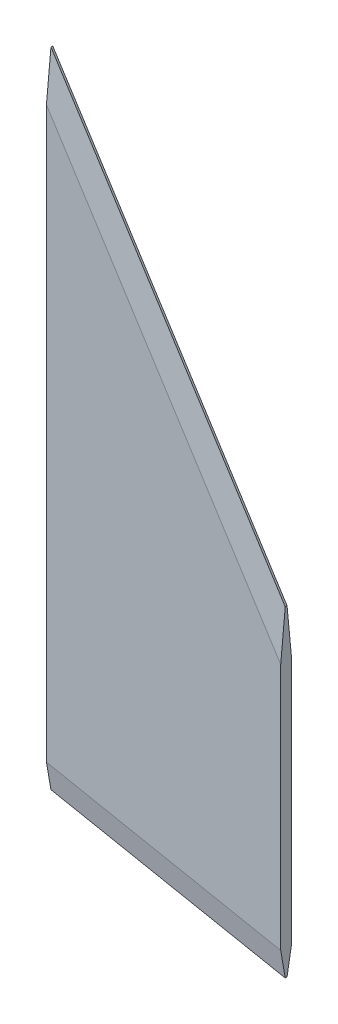
ISO-10303-21;
HEADER;
FILE_DESCRIPTION(('STEP AP214'),'2;1');
FILE_NAME('part.step','',(''),(''),'','','');
FILE_SCHEMA(('AUTOMOTIVE_DESIGN { 1 0 10303 214 1 1 1 1 }'));
ENDSEC;
DATA;
#1=APPLICATION_CONTEXT('core data for automotive mechanical design processes');
#2=APPLICATION_PROTOCOL_DEFINITION('international standard','automotive_design',2000,#1);
#3=PRODUCT_CONTEXT('',#1,'mechanical');
#4=PRODUCT('Part','Part','',(#3));
#5=PRODUCT_RELATED_PRODUCT_CATEGORY('part','',(#4));
#6=PRODUCT_DEFINITION_FORMATION('','',#4);
#7=PRODUCT_DEFINITION_CONTEXT('part definition',#1,'design');
#8=PRODUCT_DEFINITION('design','',#6,#7);
#9=PRODUCT_DEFINITION_SHAPE('','',#8);
#10=(LENGTH_UNIT() NAMED_UNIT(*) SI_UNIT(.MILLI.,.METRE.));
#11=(NAMED_UNIT(*) PLANE_ANGLE_UNIT() SI_UNIT($,.RADIAN.));
#12=(NAMED_UNIT(*) SI_UNIT($,.STERADIAN.) SOLID_ANGLE_UNIT());
#13=UNCERTAINTY_MEASURE_WITH_UNIT(LENGTH_MEASURE(1.E-05),#10,'distance_accuracy_value','');
#14=(GEOMETRIC_REPRESENTATION_CONTEXT(3) GLOBAL_UNCERTAINTY_ASSIGNED_CONTEXT((#13)) GLOBAL_UNIT_ASSIGNED_CONTEXT((#10,
#11,#12)) REPRESENTATION_CONTEXT('',''));
#15=CARTESIAN_POINT('',(0.,0.,0.));
#16=DIRECTION('',(0.,0.,1.));
#17=DIRECTION('',(1.,0.,0.));
#18=AXIS2_PLACEMENT_3D('',#15,#16,#17);
#19=CARTESIAN_POINT('',(3.78840025033068,-2.26848731655438,1.5));
#20=DIRECTION('',(-0.843227198057324,-0.537557338761545,0.));
#21=DIRECTION('',(0.537557338761545,-0.843227198057324,0.));
#22=AXIS2_PLACEMENT_3D('',#19,#20,#21);
#23=PLANE('',#22);
#24=DIRECTION('',(0.,0.,-1.));
#25=VECTOR('',#24,1.);
#26=CARTESIAN_POINT('',(3.78840025033068,-2.26848731655438,1.5));
#27=LINE('',#26,#25);
#28=CARTESIAN_POINT('',(3.78840025033068,-2.26848731655438,0.249999999999992));
#29=VERTEX_POINT('',#28);
#30=CARTESIAN_POINT('',(3.78840025033068,-2.26848731655438,-0.249999999999992));
#31=VERTEX_POINT('',#30);
#32=EDGE_CURVE('E138',#29,#31,#27,.T.);
#33=ORIENTED_EDGE('',*,*,#32,.T.);
#34=DIRECTION('',(-0.537557338761545,0.843227198057324,0.));
#35=VECTOR('',#34,1.);
#36=CARTESIAN_POINT('',(-60.9815997496693,99.3315126834455,-0.249999999999992));
#37=LINE('',#36,#35);
#38=CARTESIAN_POINT('',(-60.9815997496693,99.3315126834455,-0.249999999999992));
#39=VERTEX_POINT('',#38);
#40=EDGE_CURVE('E11',#31,#39,#37,.T.);
#41=ORIENTED_EDGE('',*,*,#40,.T.);
#42=DIRECTION('',(0.,0.,-1.));
#43=VECTOR('',#42,1.);
#44=CARTESIAN_POINT('',(-60.9815997496693,99.3315126834455,1.5));
#45=LINE('',#44,#43);
#46=CARTESIAN_POINT('',(-60.9815997496693,99.3315126834455,0.249999999999992));
#47=VERTEX_POINT('',#46);
#48=EDGE_CURVE('E143',#47,#39,#45,.T.);
#49=ORIENTED_EDGE('',*,*,#48,.F.);
#50=DIRECTION('',(0.537557338761545,-0.843227198057324,0.));
#51=VECTOR('',#50,1.);
#52=CARTESIAN_POINT('',(3.78840025033068,-2.26848731655438,0.249999999999992));
#53=LINE('',#52,#51);
#54=EDGE_CURVE('E58',#47,#29,#53,.T.);
#55=ORIENTED_EDGE('',*,*,#54,.T.);
#56=EDGE_LOOP('',(#33,#41,#49,#55));
#57=FACE_BOUND('',#56,.T.);
#58=ADVANCED_FACE('F49',(#57),#23,.F.);
#59=CARTESIAN_POINT('',(-60.9815997496693,99.3315126834455,1.5));
#60=DIRECTION('',(1.,0.,0.));
#61=DIRECTION('',(0.,1.,0.));
#62=AXIS2_PLACEMENT_3D('',#59,#60,#61);
#63=PLANE('',#62);
#64=DIRECTION('',(0.,-1.,0.));
#65=VECTOR('',#64,1.);
#66=CARTESIAN_POINT('',(-60.9815997496693,99.3315126834455,-1.5));
#67=LINE('',#66,#65);
#68=CARTESIAN_POINT('',(-60.9815997496693,86.1438920086827,-1.5));
#69=VERTEX_POINT('',#68);
#70=CARTESIAN_POINT('',(-60.9815997496693,-71.2443938226494,-1.5));
#71=VERTEX_POINT('',#70);
#72=EDGE_CURVE('E185',#69,#71,#67,.T.);
#73=ORIENTED_EDGE('',*,*,#72,.T.);
#74=DIRECTION('',(0.,-0.985357928398178,0.170498542348173));
#75=VECTOR('',#74,1.);
#76=CARTESIAN_POINT('',(-60.9815997496693,-78.4684873165544,-0.249999999999992));
#77=LINE('',#76,#75);
#78=CARTESIAN_POINT('',(-60.9815997496693,-78.4684873165544,-0.249999999999992));
#79=VERTEX_POINT('',#78);
#80=EDGE_CURVE('E160',#71,#79,#77,.T.);
#81=ORIENTED_EDGE('',*,*,#80,.T.);
#82=DIRECTION('',(0.,0.,-1.));
#83=VECTOR('',#82,1.);
#84=CARTESIAN_POINT('',(-60.9815997496693,-78.4684873165544,1.5));
#85=LINE('',#84,#83);
#86=CARTESIAN_POINT('',(-60.9815997496693,-78.4684873165544,0.249999999999992));
#87=VERTEX_POINT('',#86);
#88=EDGE_CURVE('E137',#87,#79,#85,.T.);
#89=ORIENTED_EDGE('',*,*,#88,.F.);
#90=DIRECTION('',(0.,-0.985357928398178,-0.170498542348173));
#91=VECTOR('',#90,1.);
#92=CARTESIAN_POINT('',(-60.9815997496693,-79.8631257600748,0.00868279447500541));
#93=LINE('',#92,#91);
#94=CARTESIAN_POINT('',(-60.9815997496693,-71.2443938226494,1.5));
#95=VERTEX_POINT('',#94);
#96=EDGE_CURVE('E142',#87,#95,#93,.F.);
#97=ORIENTED_EDGE('',*,*,#96,.T.);
#98=DIRECTION('',(0.,-1.,0.));
#99=VECTOR('',#98,1.);
#100=CARTESIAN_POINT('',(-60.9815997496693,99.3315126834455,1.5));
#101=LINE('',#100,#99);
#102=CARTESIAN_POINT('',(-60.9815997496693,86.1438920086828,1.5));
#103=VERTEX_POINT('',#102);
#104=EDGE_CURVE('E179',#103,#95,#101,.T.);
#105=ORIENTED_EDGE('',*,*,#104,.F.);
#106=DIRECTION('',(0.,-0.995537864795251,0.0943629151675199));
#107=VECTOR('',#106,1.);
#108=CARTESIAN_POINT('',(-60.9815997496693,-1.95756644477262,9.85077272715086));
#109=LINE('',#108,#107);
#110=EDGE_CURVE('E72',#103,#47,#109,.F.);
#111=ORIENTED_EDGE('',*,*,#110,.T.);
#112=ORIENTED_EDGE('',*,*,#48,.T.);
#113=DIRECTION('',(0.,-0.995537864795251,-0.0943629151675195));
#114=VECTOR('',#113,1.);
#115=CARTESIAN_POINT('',(-60.9815997496693,-1.36380436504888,-9.79449247630353));
#116=LINE('',#115,#114);
#117=EDGE_CURVE('E65',#39,#69,#116,.T.);
#118=ORIENTED_EDGE('',*,*,#117,.T.);
#119=EDGE_LOOP('',(#73,#81,#89,#97,#105,#111,#112,#118));
#120=FACE_BOUND('',#119,.T.);
#121=ADVANCED_FACE('F181',(#120),#63,.F.);
#122=CARTESIAN_POINT('',(-60.9815997496693,-78.4684873165544,1.5));
#123=DIRECTION('',(0.19241446072101,0.981313749677157,0.));
#124=DIRECTION('',(-0.981313749677158,0.19241446072101,0.));
#125=AXIS2_PLACEMENT_3D('',#122,#123,#124);
#126=PLANE('',#125);
#127=ORIENTED_EDGE('',*,*,#88,.T.);
#128=DIRECTION('',(0.981313749677158,-0.19241446072101,0.));
#129=VECTOR('',#128,1.);
#130=CARTESIAN_POINT('',(3.7884002503307,-91.1684873165544,-0.249999999999992));
#131=LINE('',#130,#129);
#132=CARTESIAN_POINT('',(3.7884002503307,-91.1684873165544,-0.249999999999992));
#133=VERTEX_POINT('',#132);
#134=EDGE_CURVE('E136',#79,#133,#131,.T.);
#135=ORIENTED_EDGE('',*,*,#134,.T.);
#136=DIRECTION('',(0.,0.,-1.));
#137=VECTOR('',#136,1.);
#138=CARTESIAN_POINT('',(3.7884002503307,-91.1684873165544,1.5));
#139=LINE('',#138,#137);
#140=CARTESIAN_POINT('',(3.7884002503307,-91.1684873165544,0.249999999999992));
#141=VERTEX_POINT('',#140);
#142=EDGE_CURVE('E119',#141,#133,#139,.T.);
#143=ORIENTED_EDGE('',*,*,#142,.F.);
#144=DIRECTION('',(-0.981313749677158,0.19241446072101,0.));
#145=VECTOR('',#144,1.);
#146=CARTESIAN_POINT('',(-60.9815997496693,-78.4684873165544,0.249999999999992));
#147=LINE('',#146,#145);
#148=EDGE_CURVE('E133',#141,#87,#147,.T.);
#149=ORIENTED_EDGE('',*,*,#148,.T.);
#150=EDGE_LOOP('',(#127,#135,#143,#149));
#151=FACE_BOUND('',#150,.T.);
#152=ADVANCED_FACE('F132',(#151),#126,.F.);
#153=CARTESIAN_POINT('',(3.7884002503307,-91.1684873165544,1.5));
#154=DIRECTION('',(-1.,0.,0.));
#155=DIRECTION('',(0.,-1.,0.));
#156=AXIS2_PLACEMENT_3D('',#153,#154,#155);
#157=PLANE('',#156);
#158=ORIENTED_EDGE('',*,*,#142,.T.);
#159=DIRECTION('',(0.,0.985357928398178,-0.170498542348173));
#160=VECTOR('',#159,1.);
#161=CARTESIAN_POINT('',(3.7884002503307,-78.8376731789286,-2.38362654913541));
#162=LINE('',#161,#160);
#163=CARTESIAN_POINT('',(3.7884002503307,-83.9443938226493,-1.5));
#164=VERTEX_POINT('',#163);
#165=EDGE_CURVE('E126',#133,#164,#162,.T.);
#166=ORIENTED_EDGE('',*,*,#165,.T.);
#167=DIRECTION('',(0.,1.,0.));
#168=VECTOR('',#167,1.);
#169=CARTESIAN_POINT('',(3.7884002503307,-91.1684873165544,-1.5));
#170=LINE('',#169,#168);
#171=CARTESIAN_POINT('',(3.78840025033069,-15.4561079913172,-1.5));
#172=VERTEX_POINT('',#171);
#173=EDGE_CURVE('E182',#164,#172,#170,.T.);
#174=ORIENTED_EDGE('',*,*,#173,.T.);
#175=DIRECTION('',(0.,0.995537864795251,0.0943629151675195));
#176=VECTOR('',#175,1.);
#177=CARTESIAN_POINT('',(3.78840025033068,-2.26848731655438,-0.249999999999992));
#178=LINE('',#177,#176);
#179=EDGE_CURVE('E127',#172,#31,#178,.T.);
#180=ORIENTED_EDGE('',*,*,#179,.T.);
#181=ORIENTED_EDGE('',*,*,#32,.F.);
#182=DIRECTION('',(0.,0.995537864795251,-0.0943629151675199));
#183=VECTOR('',#182,1.);
#184=CARTESIAN_POINT('',(3.78840025033068,-2.86224939627813,0.306280250847292));
#185=LINE('',#184,#183);
#186=CARTESIAN_POINT('',(3.78840025033069,-15.4561079913172,1.5));
#187=VERTEX_POINT('',#186);
#188=EDGE_CURVE('E145',#29,#187,#185,.F.);
#189=ORIENTED_EDGE('',*,*,#188,.T.);
#190=DIRECTION('',(0.,1.,0.));
#191=VECTOR('',#190,1.);
#192=CARTESIAN_POINT('',(3.7884002503307,-91.1684873165544,1.5));
#193=LINE('',#192,#191);
#194=CARTESIAN_POINT('',(3.7884002503307,-83.9443938226493,1.5));
#195=VERTEX_POINT('',#194);
#196=EDGE_CURVE('E121',#195,#187,#193,.T.);
#197=ORIENTED_EDGE('',*,*,#196,.F.);
#198=DIRECTION('',(0.,0.985357928398178,0.170498542348173));
#199=VECTOR('',#198,1.);
#200=CARTESIAN_POINT('',(3.7884002503307,-80.2323116224489,2.14230934361042));
#201=LINE('',#200,#199);
#202=EDGE_CURVE('E116',#195,#141,#201,.F.);
#203=ORIENTED_EDGE('',*,*,#202,.T.);
#204=EDGE_LOOP('',(#158,#166,#174,#180,#181,#189,#197,#203));
#205=FACE_BOUND('',#204,.T.);
#206=ADVANCED_FACE('F118',(#205),#157,.F.);
#207=CARTESIAN_POINT('',(0.,0.,1.5));
#208=DIRECTION('',(0.,0.,-1.));
#209=DIRECTION('',(-1.,0.,0.));
#210=AXIS2_PLACEMENT_3D('',#207,#208,#209);
#211=PLANE('',#210);
#212=ORIENTED_EDGE('',*,*,#104,.T.);
#213=DIRECTION('',(0.981313749677158,-0.19241446072101,0.));
#214=VECTOR('',#213,1.);
#215=CARTESIAN_POINT('',(-15.7100336262562,-80.1211714939068,1.5));
#216=LINE('',#215,#214);
#217=EDGE_CURVE('E165',#95,#195,#216,.T.);
#218=ORIENTED_EDGE('',*,*,#217,.T.);
#219=ORIENTED_EDGE('',*,*,#196,.T.);
#220=DIRECTION('',(-0.537557338761545,0.843227198057324,0.));
#221=VECTOR('',#220,1.);
#222=CARTESIAN_POINT('',(-4.31231629846213,-2.74910164026961,1.5));
#223=LINE('',#222,#221);
#224=EDGE_CURVE('E162',#187,#103,#223,.T.);
#225=ORIENTED_EDGE('',*,*,#224,.T.);
#226=EDGE_LOOP('',(#212,#218,#219,#225));
#227=FACE_BOUND('',#226,.T.);
#228=ADVANCED_FACE('F178',(#227),#211,.F.);
#229=CARTESIAN_POINT('',(0.,0.,-1.5));
#230=DIRECTION('',(0.,0.,-1.));
#231=DIRECTION('',(-1.,0.,0.));
#232=AXIS2_PLACEMENT_3D('',#229,#230,#231);
#233=PLANE('',#232);
#234=ORIENTED_EDGE('',*,*,#173,.F.);
#235=DIRECTION('',(-0.981313749677158,0.19241446072101,0.));
#236=VECTOR('',#235,1.);
#237=CARTESIAN_POINT('',(-59.617553958521,-71.5118537816981,-1.5));
#238=LINE('',#237,#236);
#239=EDGE_CURVE('E155',#164,#71,#238,.T.);
#240=ORIENTED_EDGE('',*,*,#239,.T.);
#241=ORIENTED_EDGE('',*,*,#72,.F.);
#242=DIRECTION('',(0.537557338761545,-0.843227198057324,0.));
#243=VECTOR('',#242,1.);
#244=CARTESIAN_POINT('',(-2.1893235973565,-6.07928626945496,-1.5));
#245=LINE('',#244,#243);
#246=EDGE_CURVE('E153',#69,#172,#245,.T.);
#247=ORIENTED_EDGE('',*,*,#246,.T.);
#248=EDGE_LOOP('',(#234,#240,#241,#247));
#249=FACE_BOUND('',#248,.T.);
#250=ADVANCED_FACE('F194',(#249),#233,.T.);
#251=CARTESIAN_POINT('',(-60.9815997496693,-78.4684873165544,-0.249999999999992));
#252=DIRECTION('',(-0.0334124204609679,-0.170403344350937,-0.984807753012209));
#253=DIRECTION('',(-0.981313749677158,0.19241446072101,0.));
#254=AXIS2_PLACEMENT_3D('',#251,#252,#253);
#255=PLANE('',#254);
#256=ORIENTED_EDGE('',*,*,#80,.F.);
#257=ORIENTED_EDGE('',*,*,#239,.F.);
#258=ORIENTED_EDGE('',*,*,#165,.F.);
#259=ORIENTED_EDGE('',*,*,#134,.F.);
#260=EDGE_LOOP('',(#256,#257,#258,#259));
#261=FACE_BOUND('',#260,.T.);
#262=ADVANCED_FACE('F190',(#261),#255,.T.);
#263=CARTESIAN_POINT('',(-15.7100336262562,-80.1211714939068,1.5));
#264=DIRECTION('',(0.0334124204609679,0.170403344350937,-0.984807753012209));
#265=DIRECTION('',(0.981313749677158,-0.19241446072101,0.));
#266=AXIS2_PLACEMENT_3D('',#263,#264,#265);
#267=PLANE('',#266);
#268=ORIENTED_EDGE('',*,*,#96,.F.);
#269=ORIENTED_EDGE('',*,*,#148,.F.);
#270=ORIENTED_EDGE('',*,*,#202,.F.);
#271=ORIENTED_EDGE('',*,*,#217,.F.);
#272=EDGE_LOOP('',(#268,#269,#270,#271));
#273=FACE_BOUND('',#272,.T.);
#274=ADVANCED_FACE('F141',(#273),#267,.F.);
#275=CARTESIAN_POINT('',(3.78840025033068,-2.26848731655438,-0.249999999999992));
#276=DIRECTION('',(0.146424866301845,0.0933458522674263,-0.984807753012208));
#277=DIRECTION('',(0.537557338761545,-0.843227198057324,0.));
#278=AXIS2_PLACEMENT_3D('',#275,#276,#277);
#279=PLANE('',#278);
#280=ORIENTED_EDGE('',*,*,#179,.F.);
#281=ORIENTED_EDGE('',*,*,#246,.F.);
#282=ORIENTED_EDGE('',*,*,#117,.F.);
#283=ORIENTED_EDGE('',*,*,#40,.F.);
#284=EDGE_LOOP('',(#280,#281,#282,#283));
#285=FACE_BOUND('',#284,.T.);
#286=ADVANCED_FACE('F196',(#285),#279,.T.);
#287=CARTESIAN_POINT('',(-4.31231629846214,-2.74910164026961,1.5));
#288=DIRECTION('',(-0.146424866301846,-0.0933458522674266,-0.984807753012208));
#289=DIRECTION('',(-0.537557338761545,0.843227198057324,0.));
#290=AXIS2_PLACEMENT_3D('',#287,#288,#289);
#291=PLANE('',#290);
#292=ORIENTED_EDGE('',*,*,#188,.F.);
#293=ORIENTED_EDGE('',*,*,#54,.F.);
#294=ORIENTED_EDGE('',*,*,#110,.F.);
#295=ORIENTED_EDGE('',*,*,#224,.F.);
#296=EDGE_LOOP('',(#292,#293,#294,#295));
#297=FACE_BOUND('',#296,.T.);
#298=ADVANCED_FACE('F52',(#297),#291,.F.);
#299=CLOSED_SHELL('',(#58,#121,#152,#206,#228,#250,#262,#274,#286,#298));
#300=MANIFOLD_SOLID_BREP('B2',#299);
#301=ADVANCED_BREP_SHAPE_REPRESENTATION('',(#18,#300),#14);
#302=SHAPE_DEFINITION_REPRESENTATION(#9,#301);
ENDSEC;
END-ISO-10303-21;
